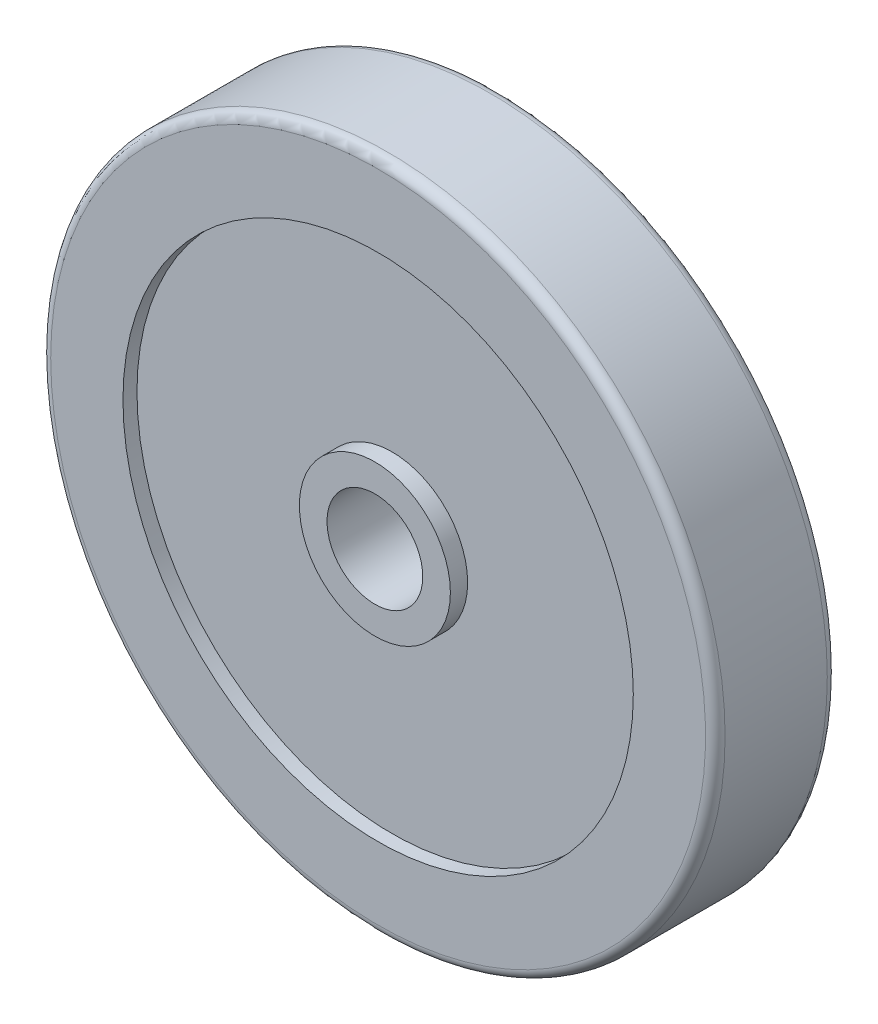
ISO-10303-21;
HEADER;
FILE_DESCRIPTION(('STEP AP214'),'2;1');
FILE_NAME('part.step','',(''),(''),'','','');
FILE_SCHEMA(('AUTOMOTIVE_DESIGN { 1 0 10303 214 1 1 1 1 }'));
ENDSEC;
DATA;
#1=APPLICATION_CONTEXT('core data for automotive mechanical design processes');
#2=APPLICATION_PROTOCOL_DEFINITION('international standard','automotive_design',2000,#1);
#3=PRODUCT_CONTEXT('',#1,'mechanical');
#4=PRODUCT('Part','Part','',(#3));
#5=PRODUCT_RELATED_PRODUCT_CATEGORY('part','',(#4));
#6=PRODUCT_DEFINITION_FORMATION('','',#4);
#7=PRODUCT_DEFINITION_CONTEXT('part definition',#1,'design');
#8=PRODUCT_DEFINITION('design','',#6,#7);
#9=PRODUCT_DEFINITION_SHAPE('','',#8);
#10=(LENGTH_UNIT() NAMED_UNIT(*) SI_UNIT(.MILLI.,.METRE.));
#11=(NAMED_UNIT(*) PLANE_ANGLE_UNIT() SI_UNIT($,.RADIAN.));
#12=(NAMED_UNIT(*) SI_UNIT($,.STERADIAN.) SOLID_ANGLE_UNIT());
#13=UNCERTAINTY_MEASURE_WITH_UNIT(LENGTH_MEASURE(1.E-05),#10,'distance_accuracy_value','');
#14=(GEOMETRIC_REPRESENTATION_CONTEXT(3) GLOBAL_UNCERTAINTY_ASSIGNED_CONTEXT((#13)) GLOBAL_UNIT_ASSIGNED_CONTEXT((#10,
#11,#12)) REPRESENTATION_CONTEXT('',''));
#15=CARTESIAN_POINT('',(0.,0.,0.));
#16=DIRECTION('',(0.,0.,1.));
#17=DIRECTION('',(1.,0.,0.));
#18=AXIS2_PLACEMENT_3D('',#15,#16,#17);
#19=CARTESIAN_POINT('',(0.,0.,15.3879310344828));
#20=DIRECTION('',(0.,0.,1.));
#21=DIRECTION('',(1.,0.,0.));
#22=AXIS2_PLACEMENT_3D('',#19,#20,#21);
#23=CYLINDRICAL_SURFACE('',#22,103.6);
#24=CARTESIAN_POINT('',(0.,0.,-15.7));
#25=DIRECTION('',(0.,0.,1.));
#26=DIRECTION('',(1.,0.,0.));
#27=AXIS2_PLACEMENT_3D('',#24,#25,#26);
#28=CIRCLE('',#27,103.6);
#29=CARTESIAN_POINT('',(103.6,0.,-15.7));
#30=VERTEX_POINT('',#29);
#31=EDGE_CURVE('E52',#30,#30,#28,.T.);
#32=ORIENTED_EDGE('',*,*,#31,.T.);
#33=EDGE_LOOP('',(#32));
#34=FACE_BOUND('',#33,.T.);
#35=CARTESIAN_POINT('',(0.,0.,15.7));
#36=DIRECTION('',(0.,0.,-1.));
#37=DIRECTION('',(-1.,0.,0.));
#38=AXIS2_PLACEMENT_3D('',#35,#36,#37);
#39=CIRCLE('',#38,103.6);
#40=CARTESIAN_POINT('',(-103.6,0.,15.7));
#41=VERTEX_POINT('',#40);
#42=EDGE_CURVE('E57',#41,#41,#39,.T.);
#43=ORIENTED_EDGE('',*,*,#42,.T.);
#44=EDGE_LOOP('',(#43));
#45=FACE_BOUND('',#44,.T.);
#46=ADVANCED_FACE('F39',(#34,#45),#23,.T.);
#47=CARTESIAN_POINT('',(0.,78.4,18.7));
#48=DIRECTION('',(0.,0.,-1.));
#49=DIRECTION('',(-1.,0.,0.));
#50=AXIS2_PLACEMENT_3D('',#47,#48,#49);
#51=PLANE('',#50);
#52=CARTESIAN_POINT('',(0.,0.,18.7));
#53=DIRECTION('',(0.,0.,-1.));
#54=DIRECTION('',(-1.,0.,0.));
#55=AXIS2_PLACEMENT_3D('',#52,#53,#54);
#56=CIRCLE('',#55,100.6);
#57=CARTESIAN_POINT('',(-100.6,0.,18.7));
#58=VERTEX_POINT('',#57);
#59=EDGE_CURVE('E10',#58,#58,#56,.F.);
#60=ORIENTED_EDGE('',*,*,#59,.T.);
#61=EDGE_LOOP('',(#60));
#62=FACE_BOUND('',#61,.T.);
#63=CARTESIAN_POINT('',(0.,0.,18.7));
#64=DIRECTION('',(0.,0.,1.));
#65=DIRECTION('',(1.,0.,0.));
#66=AXIS2_PLACEMENT_3D('',#63,#64,#65);
#67=CIRCLE('',#66,78.4);
#68=CARTESIAN_POINT('',(78.4,0.,18.7));
#69=VERTEX_POINT('',#68);
#70=EDGE_CURVE('E62',#69,#69,#67,.T.);
#71=ORIENTED_EDGE('',*,*,#70,.F.);
#72=EDGE_LOOP('',(#71));
#73=FACE_BOUND('',#72,.T.);
#74=ADVANCED_FACE('F170',(#62,#73),#51,.F.);
#75=CARTESIAN_POINT('',(0.,0.,15.3879310344828));
#76=DIRECTION('',(0.,0.,1.));
#77=DIRECTION('',(1.,0.,0.));
#78=AXIS2_PLACEMENT_3D('',#75,#76,#77);
#79=CYLINDRICAL_SURFACE('',#78,78.4);
#80=CARTESIAN_POINT('',(0.,0.,14.4));
#81=DIRECTION('',(0.,0.,1.));
#82=DIRECTION('',(1.,0.,0.));
#83=AXIS2_PLACEMENT_3D('',#80,#81,#82);
#84=CIRCLE('',#83,78.4);
#85=CARTESIAN_POINT('',(78.4,0.,14.4));
#86=VERTEX_POINT('',#85);
#87=EDGE_CURVE('E65',#86,#86,#84,.T.);
#88=ORIENTED_EDGE('',*,*,#87,.F.);
#89=EDGE_LOOP('',(#88));
#90=FACE_BOUND('',#89,.T.);
#91=ORIENTED_EDGE('',*,*,#70,.T.);
#92=EDGE_LOOP('',(#91));
#93=FACE_BOUND('',#92,.T.);
#94=ADVANCED_FACE('F166',(#90,#93),#79,.F.);
#95=CARTESIAN_POINT('',(0.,23.2,14.4));
#96=DIRECTION('',(0.,0.,-1.));
#97=DIRECTION('',(-1.,0.,0.));
#98=AXIS2_PLACEMENT_3D('',#95,#96,#97);
#99=PLANE('',#98);
#100=CARTESIAN_POINT('',(0.,0.,14.4));
#101=DIRECTION('',(0.,0.,1.));
#102=DIRECTION('',(1.,0.,0.));
#103=AXIS2_PLACEMENT_3D('',#100,#101,#102);
#104=CIRCLE('',#103,23.2);
#105=CARTESIAN_POINT('',(23.2,0.,14.4));
#106=VERTEX_POINT('',#105);
#107=EDGE_CURVE('E68',#106,#106,#104,.T.);
#108=ORIENTED_EDGE('',*,*,#107,.F.);
#109=EDGE_LOOP('',(#108));
#110=FACE_BOUND('',#109,.T.);
#111=ORIENTED_EDGE('',*,*,#87,.T.);
#112=EDGE_LOOP('',(#111));
#113=FACE_BOUND('',#112,.T.);
#114=ADVANCED_FACE('F162',(#110,#113),#99,.F.);
#115=CARTESIAN_POINT('',(0.,0.,15.3879310344828));
#116=DIRECTION('',(0.,0.,1.));
#117=DIRECTION('',(1.,0.,0.));
#118=AXIS2_PLACEMENT_3D('',#115,#116,#117);
#119=CYLINDRICAL_SURFACE('',#118,23.2);
#120=CARTESIAN_POINT('',(0.,0.,19.7));
#121=DIRECTION('',(0.,0.,1.));
#122=DIRECTION('',(1.,0.,0.));
#123=AXIS2_PLACEMENT_3D('',#120,#121,#122);
#124=CIRCLE('',#123,23.2);
#125=CARTESIAN_POINT('',(23.2,0.,19.7));
#126=VERTEX_POINT('',#125);
#127=EDGE_CURVE('E71',#126,#126,#124,.T.);
#128=ORIENTED_EDGE('',*,*,#127,.F.);
#129=EDGE_LOOP('',(#128));
#130=FACE_BOUND('',#129,.T.);
#131=ORIENTED_EDGE('',*,*,#107,.T.);
#132=EDGE_LOOP('',(#131));
#133=FACE_BOUND('',#132,.T.);
#134=ADVANCED_FACE('F158',(#130,#133),#119,.T.);
#135=CARTESIAN_POINT('',(0.,14.7,19.7));
#136=DIRECTION('',(0.,0.,-1.));
#137=DIRECTION('',(-1.,0.,0.));
#138=AXIS2_PLACEMENT_3D('',#135,#136,#137);
#139=PLANE('',#138);
#140=CARTESIAN_POINT('',(0.,0.,19.7));
#141=DIRECTION('',(0.,0.,1.));
#142=DIRECTION('',(1.,0.,0.));
#143=AXIS2_PLACEMENT_3D('',#140,#141,#142);
#144=CIRCLE('',#143,14.7);
#145=CARTESIAN_POINT('',(14.7,0.,19.7));
#146=VERTEX_POINT('',#145);
#147=EDGE_CURVE('E74',#146,#146,#144,.T.);
#148=ORIENTED_EDGE('',*,*,#147,.F.);
#149=EDGE_LOOP('',(#148));
#150=FACE_BOUND('',#149,.T.);
#151=ORIENTED_EDGE('',*,*,#127,.T.);
#152=EDGE_LOOP('',(#151));
#153=FACE_BOUND('',#152,.T.);
#154=ADVANCED_FACE('F154',(#150,#153),#139,.F.);
#155=CARTESIAN_POINT('',(0.,0.,15.3879310344828));
#156=DIRECTION('',(0.,0.,1.));
#157=DIRECTION('',(1.,0.,0.));
#158=AXIS2_PLACEMENT_3D('',#155,#156,#157);
#159=CYLINDRICAL_SURFACE('',#158,14.7);
#160=CARTESIAN_POINT('',(0.,0.,-19.7));
#161=DIRECTION('',(0.,0.,1.));
#162=DIRECTION('',(1.,0.,0.));
#163=AXIS2_PLACEMENT_3D('',#160,#161,#162);
#164=CIRCLE('',#163,14.7);
#165=CARTESIAN_POINT('',(14.7,0.,-19.7));
#166=VERTEX_POINT('',#165);
#167=EDGE_CURVE('E77',#166,#166,#164,.T.);
#168=ORIENTED_EDGE('',*,*,#167,.F.);
#169=EDGE_LOOP('',(#168));
#170=FACE_BOUND('',#169,.T.);
#171=ORIENTED_EDGE('',*,*,#147,.T.);
#172=EDGE_LOOP('',(#171));
#173=FACE_BOUND('',#172,.T.);
#174=ADVANCED_FACE('F150',(#170,#173),#159,.F.);
#175=CARTESIAN_POINT('',(0.,14.7,-19.7));
#176=DIRECTION('',(0.,0.,1.));
#177=DIRECTION('',(1.,0.,0.));
#178=AXIS2_PLACEMENT_3D('',#175,#176,#177);
#179=PLANE('',#178);
#180=CARTESIAN_POINT('',(0.,0.,-19.7));
#181=DIRECTION('',(0.,0.,1.));
#182=DIRECTION('',(1.,0.,0.));
#183=AXIS2_PLACEMENT_3D('',#180,#181,#182);
#184=CIRCLE('',#183,23.2);
#185=CARTESIAN_POINT('',(23.2,0.,-19.7));
#186=VERTEX_POINT('',#185);
#187=EDGE_CURVE('E80',#186,#186,#184,.T.);
#188=ORIENTED_EDGE('',*,*,#187,.F.);
#189=EDGE_LOOP('',(#188));
#190=FACE_BOUND('',#189,.T.);
#191=ORIENTED_EDGE('',*,*,#167,.T.);
#192=EDGE_LOOP('',(#191));
#193=FACE_BOUND('',#192,.T.);
#194=ADVANCED_FACE('F146',(#190,#193),#179,.F.);
#195=CARTESIAN_POINT('',(0.,0.,15.3879310344828));
#196=DIRECTION('',(0.,0.,1.));
#197=DIRECTION('',(1.,0.,0.));
#198=AXIS2_PLACEMENT_3D('',#195,#196,#197);
#199=CYLINDRICAL_SURFACE('',#198,23.2);
#200=CARTESIAN_POINT('',(0.,0.,-14.4));
#201=DIRECTION('',(0.,0.,1.));
#202=DIRECTION('',(1.,0.,0.));
#203=AXIS2_PLACEMENT_3D('',#200,#201,#202);
#204=CIRCLE('',#203,23.2);
#205=CARTESIAN_POINT('',(23.2,0.,-14.4));
#206=VERTEX_POINT('',#205);
#207=EDGE_CURVE('E83',#206,#206,#204,.T.);
#208=ORIENTED_EDGE('',*,*,#207,.F.);
#209=EDGE_LOOP('',(#208));
#210=FACE_BOUND('',#209,.T.);
#211=ORIENTED_EDGE('',*,*,#187,.T.);
#212=EDGE_LOOP('',(#211));
#213=FACE_BOUND('',#212,.T.);
#214=ADVANCED_FACE('F142',(#210,#213),#199,.T.);
#215=CARTESIAN_POINT('',(0.,23.2,-14.4));
#216=DIRECTION('',(0.,0.,1.));
#217=DIRECTION('',(1.,0.,0.));
#218=AXIS2_PLACEMENT_3D('',#215,#216,#217);
#219=PLANE('',#218);
#220=CARTESIAN_POINT('',(0.,0.,-14.4));
#221=DIRECTION('',(0.,0.,1.));
#222=DIRECTION('',(1.,0.,0.));
#223=AXIS2_PLACEMENT_3D('',#220,#221,#222);
#224=CIRCLE('',#223,78.4);
#225=CARTESIAN_POINT('',(78.4,0.,-14.4));
#226=VERTEX_POINT('',#225);
#227=EDGE_CURVE('E86',#226,#226,#224,.T.);
#228=ORIENTED_EDGE('',*,*,#227,.F.);
#229=EDGE_LOOP('',(#228));
#230=FACE_BOUND('',#229,.T.);
#231=ORIENTED_EDGE('',*,*,#207,.T.);
#232=EDGE_LOOP('',(#231));
#233=FACE_BOUND('',#232,.T.);
#234=ADVANCED_FACE('F138',(#230,#233),#219,.F.);
#235=CARTESIAN_POINT('',(0.,0.,15.3879310344828));
#236=DIRECTION('',(0.,0.,1.));
#237=DIRECTION('',(1.,0.,0.));
#238=AXIS2_PLACEMENT_3D('',#235,#236,#237);
#239=CYLINDRICAL_SURFACE('',#238,78.4);
#240=CARTESIAN_POINT('',(0.,0.,-18.7));
#241=DIRECTION('',(0.,0.,1.));
#242=DIRECTION('',(1.,0.,0.));
#243=AXIS2_PLACEMENT_3D('',#240,#241,#242);
#244=CIRCLE('',#243,78.4);
#245=CARTESIAN_POINT('',(78.4,0.,-18.7));
#246=VERTEX_POINT('',#245);
#247=EDGE_CURVE('E90',#246,#246,#244,.T.);
#248=ORIENTED_EDGE('',*,*,#247,.F.);
#249=EDGE_LOOP('',(#248));
#250=FACE_BOUND('',#249,.T.);
#251=ORIENTED_EDGE('',*,*,#227,.T.);
#252=EDGE_LOOP('',(#251));
#253=FACE_BOUND('',#252,.T.);
#254=ADVANCED_FACE('F135',(#250,#253),#239,.F.);
#255=CARTESIAN_POINT('',(0.,78.4,-18.7));
#256=DIRECTION('',(0.,0.,1.));
#257=DIRECTION('',(1.,0.,0.));
#258=AXIS2_PLACEMENT_3D('',#255,#256,#257);
#259=PLANE('',#258);
#260=CARTESIAN_POINT('',(0.,0.,-18.7));
#261=DIRECTION('',(0.,0.,1.));
#262=DIRECTION('',(1.,0.,0.));
#263=AXIS2_PLACEMENT_3D('',#260,#261,#262);
#264=CIRCLE('',#263,100.6);
#265=CARTESIAN_POINT('',(100.6,0.,-18.7));
#266=VERTEX_POINT('',#265);
#267=EDGE_CURVE('E47',#266,#266,#264,.F.);
#268=ORIENTED_EDGE('',*,*,#267,.T.);
#269=EDGE_LOOP('',(#268));
#270=FACE_BOUND('',#269,.T.);
#271=ORIENTED_EDGE('',*,*,#247,.T.);
#272=EDGE_LOOP('',(#271));
#273=FACE_BOUND('',#272,.T.);
#274=ADVANCED_FACE('F131',(#270,#273),#259,.F.);
#275=CARTESIAN_POINT('',(0.,0.,-15.7));
#276=DIRECTION('',(0.,0.,1.));
#277=DIRECTION('',(1.,0.,0.));
#278=AXIS2_PLACEMENT_3D('',#275,#276,#277);
#279=TOROIDAL_SURFACE('',#278,100.6,3.);
#280=ORIENTED_EDGE('',*,*,#267,.F.);
#281=EDGE_LOOP('',(#280));
#282=FACE_BOUND('',#281,.T.);
#283=ORIENTED_EDGE('',*,*,#31,.F.);
#284=EDGE_LOOP('',(#283));
#285=FACE_BOUND('',#284,.T.);
#286=ADVANCED_FACE('F134',(#282,#285),#279,.T.);
#287=CARTESIAN_POINT('',(0.,0.,15.7));
#288=DIRECTION('',(0.,0.,-1.));
#289=DIRECTION('',(-1.,0.,0.));
#290=AXIS2_PLACEMENT_3D('',#287,#288,#289);
#291=TOROIDAL_SURFACE('',#290,100.6,3.);
#292=ORIENTED_EDGE('',*,*,#42,.F.);
#293=EDGE_LOOP('',(#292));
#294=FACE_BOUND('',#293,.T.);
#295=ORIENTED_EDGE('',*,*,#59,.F.);
#296=EDGE_LOOP('',(#295));
#297=FACE_BOUND('',#296,.T.);
#298=ADVANCED_FACE('F41',(#294,#297),#291,.T.);
#299=CLOSED_SHELL('',(#46,#74,#94,#114,#134,#154,#174,#194,#214,#234,#254,#274,#286,#298));
#300=CARTESIAN_POINT('',(0.,0.,15.3879310344828));
#301=DIRECTION('',(0.,0.,1.));
#302=DIRECTION('',(1.,0.,0.));
#303=AXIS2_PLACEMENT_3D('',#300,#301,#302);
#304=CYLINDRICAL_SURFACE('',#303,98.8595181841276);
#305=CARTESIAN_POINT('',(0.,0.,7.50000000000001));
#306=DIRECTION('',(0.,0.,1.));
#307=DIRECTION('',(1.,0.,0.));
#308=AXIS2_PLACEMENT_3D('',#305,#306,#307);
#309=CIRCLE('',#308,98.8595181841276);
#310=CARTESIAN_POINT('',(98.8595181841276,0.,7.50000000000001));
#311=VERTEX_POINT('',#310);
#312=EDGE_CURVE('E103',#311,#311,#309,.T.);
#313=ORIENTED_EDGE('',*,*,#312,.T.);
#314=EDGE_LOOP('',(#313));
#315=FACE_BOUND('',#314,.T.);
#316=CARTESIAN_POINT('',(0.,0.,-7.49999999999999));
#317=DIRECTION('',(0.,0.,1.));
#318=DIRECTION('',(1.,0.,0.));
#319=AXIS2_PLACEMENT_3D('',#316,#317,#318);
#320=CIRCLE('',#319,98.8595181841276);
#321=CARTESIAN_POINT('',(98.8595181841276,0.,-7.49999999999999));
#322=VERTEX_POINT('',#321);
#323=EDGE_CURVE('E93',#322,#322,#320,.T.);
#324=ORIENTED_EDGE('',*,*,#323,.F.);
#325=EDGE_LOOP('',(#324));
#326=FACE_BOUND('',#325,.T.);
#327=ADVANCED_FACE('F107',(#315,#326),#304,.F.);
#328=CARTESIAN_POINT('',(0.,98.8595181841276,-7.49999999999999));
#329=DIRECTION('',(0.,0.,1.));
#330=DIRECTION('',(1.,0.,0.));
#331=AXIS2_PLACEMENT_3D('',#328,#329,#330);
#332=PLANE('',#331);
#333=ORIENTED_EDGE('',*,*,#323,.T.);
#334=EDGE_LOOP('',(#333));
#335=FACE_BOUND('',#334,.T.);
#336=CARTESIAN_POINT('',(0.,0.,-7.49999999999999));
#337=DIRECTION('',(0.,0.,1.));
#338=DIRECTION('',(1.,0.,0.));
#339=AXIS2_PLACEMENT_3D('',#336,#337,#338);
#340=CIRCLE('',#339,22.8942645864193);
#341=CARTESIAN_POINT('',(22.8942645864193,0.,-7.49999999999999));
#342=VERTEX_POINT('',#341);
#343=EDGE_CURVE('E97',#342,#342,#340,.T.);
#344=ORIENTED_EDGE('',*,*,#343,.F.);
#345=EDGE_LOOP('',(#344));
#346=FACE_BOUND('',#345,.T.);
#347=ADVANCED_FACE('F119',(#335,#346),#332,.T.);
#348=CARTESIAN_POINT('',(0.,0.,15.3879310344828));
#349=DIRECTION('',(0.,0.,1.));
#350=DIRECTION('',(1.,0.,0.));
#351=AXIS2_PLACEMENT_3D('',#348,#349,#350);
#352=CYLINDRICAL_SURFACE('',#351,22.8942645864193);
#353=ORIENTED_EDGE('',*,*,#343,.T.);
#354=EDGE_LOOP('',(#353));
#355=FACE_BOUND('',#354,.T.);
#356=CARTESIAN_POINT('',(0.,0.,7.50000000000001));
#357=DIRECTION('',(0.,0.,1.));
#358=DIRECTION('',(1.,0.,0.));
#359=AXIS2_PLACEMENT_3D('',#356,#357,#358);
#360=CIRCLE('',#359,22.8942645864193);
#361=CARTESIAN_POINT('',(22.8942645864193,0.,7.50000000000001));
#362=VERTEX_POINT('',#361);
#363=EDGE_CURVE('E100',#362,#362,#360,.T.);
#364=ORIENTED_EDGE('',*,*,#363,.F.);
#365=EDGE_LOOP('',(#364));
#366=FACE_BOUND('',#365,.T.);
#367=ADVANCED_FACE('F112',(#355,#366),#352,.T.);
#368=CARTESIAN_POINT('',(0.,98.8595181841276,7.50000000000001));
#369=DIRECTION('',(0.,0.,-1.));
#370=DIRECTION('',(-1.,0.,0.));
#371=AXIS2_PLACEMENT_3D('',#368,#369,#370);
#372=PLANE('',#371);
#373=ORIENTED_EDGE('',*,*,#363,.T.);
#374=EDGE_LOOP('',(#373));
#375=FACE_BOUND('',#374,.T.);
#376=ORIENTED_EDGE('',*,*,#312,.F.);
#377=EDGE_LOOP('',(#376));
#378=FACE_BOUND('',#377,.T.);
#379=ADVANCED_FACE('F110',(#375,#378),#372,.T.);
#380=CLOSED_SHELL('',(#327,#347,#367,#379));
#381=ORIENTED_CLOSED_SHELL('',*,#380,.T.);
#382=BREP_WITH_VOIDS('B2',#299,(#381));
#383=ADVANCED_BREP_SHAPE_REPRESENTATION('',(#18,#382),#14);
#384=SHAPE_DEFINITION_REPRESENTATION(#9,#383);
ENDSEC;
END-ISO-10303-21;
